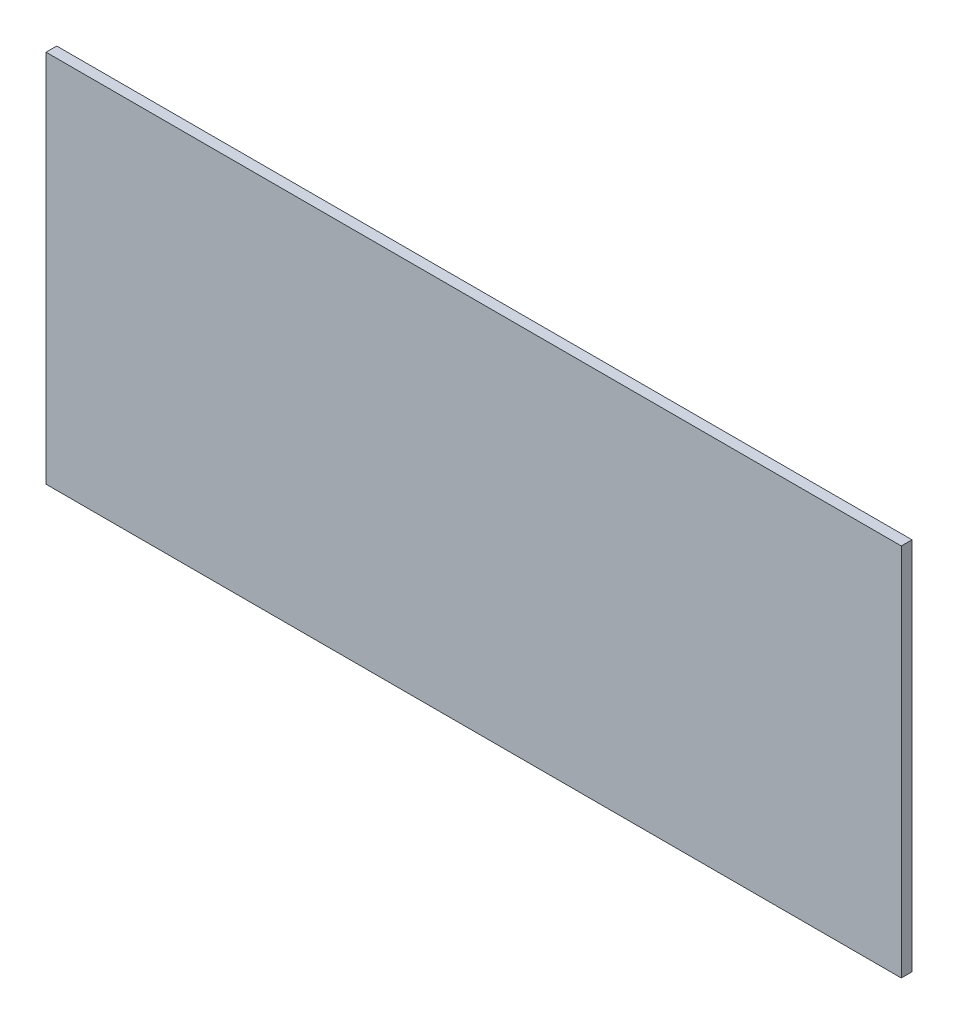
ISO-10303-21;
HEADER;
FILE_DESCRIPTION(('STEP AP214'),'2;1');
FILE_NAME('part.step','',(''),(''),'','','');
FILE_SCHEMA(('AUTOMOTIVE_DESIGN { 1 0 10303 214 1 1 1 1 }'));
ENDSEC;
DATA;
#1=APPLICATION_CONTEXT('core data for automotive mechanical design processes');
#2=APPLICATION_PROTOCOL_DEFINITION('international standard','automotive_design',2000,#1);
#3=PRODUCT_CONTEXT('',#1,'mechanical');
#4=PRODUCT('Part','Part','',(#3));
#5=PRODUCT_RELATED_PRODUCT_CATEGORY('part','',(#4));
#6=PRODUCT_DEFINITION_FORMATION('','',#4);
#7=PRODUCT_DEFINITION_CONTEXT('part definition',#1,'design');
#8=PRODUCT_DEFINITION('design','',#6,#7);
#9=PRODUCT_DEFINITION_SHAPE('','',#8);
#10=(LENGTH_UNIT() NAMED_UNIT(*) SI_UNIT(.MILLI.,.METRE.));
#11=(NAMED_UNIT(*) PLANE_ANGLE_UNIT() SI_UNIT($,.RADIAN.));
#12=(NAMED_UNIT(*) SI_UNIT($,.STERADIAN.) SOLID_ANGLE_UNIT());
#13=UNCERTAINTY_MEASURE_WITH_UNIT(LENGTH_MEASURE(1.E-05),#10,'distance_accuracy_value','');
#14=(GEOMETRIC_REPRESENTATION_CONTEXT(3) GLOBAL_UNCERTAINTY_ASSIGNED_CONTEXT((#13)) GLOBAL_UNIT_ASSIGNED_CONTEXT((#10,
#11,#12)) REPRESENTATION_CONTEXT('',''));
#15=CARTESIAN_POINT('',(0.,0.,0.));
#16=DIRECTION('',(0.,0.,1.));
#17=DIRECTION('',(1.,0.,0.));
#18=AXIS2_PLACEMENT_3D('',#15,#16,#17);
#19=CARTESIAN_POINT('',(0.,0.,10.));
#20=DIRECTION('',(0.,0.,1.));
#21=DIRECTION('',(1.,0.,0.));
#22=AXIS2_PLACEMENT_3D('',#19,#20,#21);
#23=PLANE('',#22);
#24=DIRECTION('',(1.,0.,0.));
#25=VECTOR('',#24,1.);
#26=CARTESIAN_POINT('',(400.,175.,10.));
#27=LINE('',#26,#25);
#28=CARTESIAN_POINT('',(-400.,175.,10.));
#29=VERTEX_POINT('',#28);
#30=CARTESIAN_POINT('',(400.,175.,10.));
#31=VERTEX_POINT('',#30);
#32=EDGE_CURVE('E68',#29,#31,#27,.T.);
#33=ORIENTED_EDGE('',*,*,#32,.F.);
#34=DIRECTION('',(0.,1.,0.));
#35=VECTOR('',#34,1.);
#36=CARTESIAN_POINT('',(-400.,175.,10.));
#37=LINE('',#36,#35);
#38=CARTESIAN_POINT('',(-400.,-175.,10.));
#39=VERTEX_POINT('',#38);
#40=EDGE_CURVE('E20',#39,#29,#37,.T.);
#41=ORIENTED_EDGE('',*,*,#40,.F.);
#42=DIRECTION('',(1.,0.,0.));
#43=VECTOR('',#42,1.);
#44=CARTESIAN_POINT('',(-400.,-175.,10.));
#45=LINE('',#44,#43);
#46=CARTESIAN_POINT('',(400.,-175.,10.));
#47=VERTEX_POINT('',#46);
#48=EDGE_CURVE('E58',#47,#39,#45,.F.);
#49=ORIENTED_EDGE('',*,*,#48,.F.);
#50=DIRECTION('',(0.,1.,0.));
#51=VECTOR('',#50,1.);
#52=CARTESIAN_POINT('',(400.,-175.,10.));
#53=LINE('',#52,#51);
#54=EDGE_CURVE('E53',#31,#47,#53,.F.);
#55=ORIENTED_EDGE('',*,*,#54,.F.);
#56=EDGE_LOOP('',(#33,#41,#49,#55));
#57=FACE_BOUND('',#56,.T.);
#58=ADVANCED_FACE('F17',(#57),#23,.T.);
#59=CARTESIAN_POINT('',(-400.,175.,0.));
#60=DIRECTION('',(-1.,0.,0.));
#61=DIRECTION('',(0.,0.,1.));
#62=AXIS2_PLACEMENT_3D('',#59,#60,#61);
#63=PLANE('',#62);
#64=DIRECTION('',(0.,0.,1.));
#65=VECTOR('',#64,1.);
#66=CARTESIAN_POINT('',(-400.,175.,0.));
#67=LINE('',#66,#65);
#68=CARTESIAN_POINT('',(-400.,175.,0.));
#69=VERTEX_POINT('',#68);
#70=EDGE_CURVE('E79',#69,#29,#67,.T.);
#71=ORIENTED_EDGE('',*,*,#70,.F.);
#72=DIRECTION('',(0.,1.,0.));
#73=VECTOR('',#72,1.);
#74=CARTESIAN_POINT('',(-400.,0.,0.));
#75=LINE('',#74,#73);
#76=CARTESIAN_POINT('',(-400.,-175.,0.));
#77=VERTEX_POINT('',#76);
#78=EDGE_CURVE('E74',#69,#77,#75,.F.);
#79=ORIENTED_EDGE('',*,*,#78,.T.);
#80=DIRECTION('',(0.,0.,-1.));
#81=VECTOR('',#80,1.);
#82=CARTESIAN_POINT('',(-400.,-175.,0.));
#83=LINE('',#82,#81);
#84=EDGE_CURVE('E63',#39,#77,#83,.T.);
#85=ORIENTED_EDGE('',*,*,#84,.F.);
#86=ORIENTED_EDGE('',*,*,#40,.T.);
#87=EDGE_LOOP('',(#71,#79,#85,#86));
#88=FACE_BOUND('',#87,.T.);
#89=ADVANCED_FACE('F73',(#88),#63,.T.);
#90=CARTESIAN_POINT('',(-400.,-175.,0.));
#91=DIRECTION('',(0.,-1.,0.));
#92=DIRECTION('',(0.,0.,-1.));
#93=AXIS2_PLACEMENT_3D('',#90,#91,#92);
#94=PLANE('',#93);
#95=ORIENTED_EDGE('',*,*,#84,.T.);
#96=DIRECTION('',(1.,0.,0.));
#97=VECTOR('',#96,1.);
#98=CARTESIAN_POINT('',(0.,-175.,0.));
#99=LINE('',#98,#97);
#100=CARTESIAN_POINT('',(400.,-175.,0.));
#101=VERTEX_POINT('',#100);
#102=EDGE_CURVE('E84',#77,#101,#99,.T.);
#103=ORIENTED_EDGE('',*,*,#102,.T.);
#104=DIRECTION('',(0.,0.,-1.));
#105=VECTOR('',#104,1.);
#106=CARTESIAN_POINT('',(400.,-175.,0.));
#107=LINE('',#106,#105);
#108=EDGE_CURVE('E65',#47,#101,#107,.T.);
#109=ORIENTED_EDGE('',*,*,#108,.F.);
#110=ORIENTED_EDGE('',*,*,#48,.T.);
#111=EDGE_LOOP('',(#95,#103,#109,#110));
#112=FACE_BOUND('',#111,.T.);
#113=ADVANCED_FACE('F60',(#112),#94,.T.);
#114=CARTESIAN_POINT('',(400.,-175.,0.));
#115=DIRECTION('',(1.,0.,0.));
#116=DIRECTION('',(0.,0.,-1.));
#117=AXIS2_PLACEMENT_3D('',#114,#115,#116);
#118=PLANE('',#117);
#119=ORIENTED_EDGE('',*,*,#108,.T.);
#120=DIRECTION('',(0.,1.,0.));
#121=VECTOR('',#120,1.);
#122=CARTESIAN_POINT('',(400.,0.,0.));
#123=LINE('',#122,#121);
#124=CARTESIAN_POINT('',(400.,175.,0.));
#125=VERTEX_POINT('',#124);
#126=EDGE_CURVE('E26',#101,#125,#123,.T.);
#127=ORIENTED_EDGE('',*,*,#126,.T.);
#128=DIRECTION('',(0.,0.,1.));
#129=VECTOR('',#128,1.);
#130=CARTESIAN_POINT('',(400.,175.,0.));
#131=LINE('',#130,#129);
#132=EDGE_CURVE('E34',#31,#125,#131,.F.);
#133=ORIENTED_EDGE('',*,*,#132,.F.);
#134=ORIENTED_EDGE('',*,*,#54,.T.);
#135=EDGE_LOOP('',(#119,#127,#133,#134));
#136=FACE_BOUND('',#135,.T.);
#137=ADVANCED_FACE('F88',(#136),#118,.T.);
#138=CARTESIAN_POINT('',(400.,175.,0.));
#139=DIRECTION('',(0.,1.,0.));
#140=DIRECTION('',(0.,0.,1.));
#141=AXIS2_PLACEMENT_3D('',#138,#139,#140);
#142=PLANE('',#141);
#143=ORIENTED_EDGE('',*,*,#132,.T.);
#144=DIRECTION('',(1.,0.,0.));
#145=VECTOR('',#144,1.);
#146=CARTESIAN_POINT('',(0.,175.,0.));
#147=LINE('',#146,#145);
#148=EDGE_CURVE('E11',#125,#69,#147,.F.);
#149=ORIENTED_EDGE('',*,*,#148,.T.);
#150=ORIENTED_EDGE('',*,*,#70,.T.);
#151=ORIENTED_EDGE('',*,*,#32,.T.);
#152=EDGE_LOOP('',(#143,#149,#150,#151));
#153=FACE_BOUND('',#152,.T.);
#154=ADVANCED_FACE('F91',(#153),#142,.T.);
#155=CARTESIAN_POINT('',(0.,0.,0.));
#156=DIRECTION('',(0.,0.,1.));
#157=DIRECTION('',(1.,0.,0.));
#158=AXIS2_PLACEMENT_3D('',#155,#156,#157);
#159=PLANE('',#158);
#160=ORIENTED_EDGE('',*,*,#126,.F.);
#161=ORIENTED_EDGE('',*,*,#102,.F.);
#162=ORIENTED_EDGE('',*,*,#78,.F.);
#163=ORIENTED_EDGE('',*,*,#148,.F.);
#164=EDGE_LOOP('',(#160,#161,#162,#163));
#165=FACE_BOUND('',#164,.T.);
#166=ADVANCED_FACE('F90',(#165),#159,.F.);
#167=CLOSED_SHELL('',(#58,#89,#113,#137,#154,#166));
#168=MANIFOLD_SOLID_BREP('B1',#167);
#169=ADVANCED_BREP_SHAPE_REPRESENTATION('',(#18,#168),#14);
#170=SHAPE_DEFINITION_REPRESENTATION(#9,#169);
ENDSEC;
END-ISO-10303-21;
